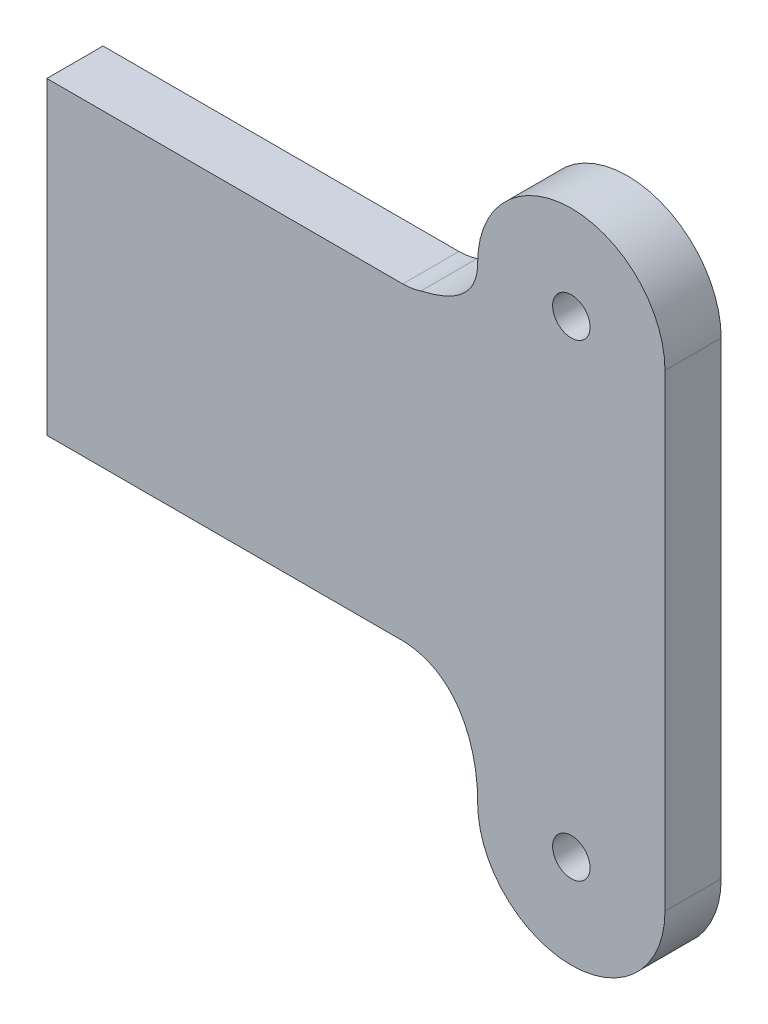
ISO-10303-21;
HEADER;
FILE_DESCRIPTION(('STEP AP214'),'2;1');
FILE_NAME('part.step','',(''),(''),'','','');
FILE_SCHEMA(('AUTOMOTIVE_DESIGN { 1 0 10303 214 1 1 1 1 }'));
ENDSEC;
DATA;
#1=APPLICATION_CONTEXT('core data for automotive mechanical design processes');
#2=APPLICATION_PROTOCOL_DEFINITION('international standard','automotive_design',2000,#1);
#3=PRODUCT_CONTEXT('',#1,'mechanical');
#4=PRODUCT('Part','Part','',(#3));
#5=PRODUCT_RELATED_PRODUCT_CATEGORY('part','',(#4));
#6=PRODUCT_DEFINITION_FORMATION('','',#4);
#7=PRODUCT_DEFINITION_CONTEXT('part definition',#1,'design');
#8=PRODUCT_DEFINITION('design','',#6,#7);
#9=PRODUCT_DEFINITION_SHAPE('','',#8);
#10=(LENGTH_UNIT() NAMED_UNIT(*) SI_UNIT(.MILLI.,.METRE.));
#11=(NAMED_UNIT(*) PLANE_ANGLE_UNIT() SI_UNIT($,.RADIAN.));
#12=(NAMED_UNIT(*) SI_UNIT($,.STERADIAN.) SOLID_ANGLE_UNIT());
#13=UNCERTAINTY_MEASURE_WITH_UNIT(LENGTH_MEASURE(1.E-05),#10,'distance_accuracy_value','');
#14=(GEOMETRIC_REPRESENTATION_CONTEXT(3) GLOBAL_UNCERTAINTY_ASSIGNED_CONTEXT((#13)) GLOBAL_UNIT_ASSIGNED_CONTEXT((#10,
#11,#12)) REPRESENTATION_CONTEXT('',''));
#15=CARTESIAN_POINT('',(0.,0.,0.));
#16=DIRECTION('',(0.,0.,1.));
#17=DIRECTION('',(1.,0.,0.));
#18=AXIS2_PLACEMENT_3D('',#15,#16,#17);
#19=CARTESIAN_POINT('',(9.,9.5,3.));
#20=DIRECTION('',(0.,0.,-1.));
#21=DIRECTION('',(-1.,0.,0.));
#22=AXIS2_PLACEMENT_3D('',#19,#20,#21);
#23=PLANE('',#22);
#24=DIRECTION('',(-1.,0.,0.));
#25=VECTOR('',#24,1.);
#26=CARTESIAN_POINT('',(0.,6.5,3.));
#27=LINE('',#26,#25);
#28=CARTESIAN_POINT('',(8.99999999999998,6.5,3.));
#29=VERTEX_POINT('',#28);
#30=CARTESIAN_POINT('',(-10.,6.5,3.));
#31=VERTEX_POINT('',#30);
#32=EDGE_CURVE('E89',#29,#31,#27,.T.);
#33=ORIENTED_EDGE('',*,*,#32,.T.);
#34=DIRECTION('',(0.,1.,0.));
#35=VECTOR('',#34,1.);
#36=CARTESIAN_POINT('',(-10.,0.,3.));
#37=LINE('',#36,#35);
#38=CARTESIAN_POINT('',(-10.,-10.,3.));
#39=VERTEX_POINT('',#38);
#40=EDGE_CURVE('E202',#39,#31,#37,.T.);
#41=ORIENTED_EDGE('',*,*,#40,.F.);
#42=DIRECTION('',(1.,0.,0.));
#43=VECTOR('',#42,1.);
#44=CARTESIAN_POINT('',(0.,-10.,3.));
#45=LINE('',#44,#43);
#46=CARTESIAN_POINT('',(8.99999999999998,-10.,3.));
#47=VERTEX_POINT('',#46);
#48=EDGE_CURVE('E98',#39,#47,#45,.T.);
#49=ORIENTED_EDGE('',*,*,#48,.T.);
#50=CARTESIAN_POINT('',(9.,-13.,3.));
#51=DIRECTION('',(0.,0.,-1.));
#52=DIRECTION('',(-1.,0.,0.));
#53=AXIS2_PLACEMENT_3D('',#50,#51,#52);
#54=CIRCLE('',#53,3.);
#55=CARTESIAN_POINT('',(9.57348949196098,-10.0553251787998,3.));
#56=VERTEX_POINT('',#55);
#57=EDGE_CURVE('E100',#47,#56,#54,.T.);
#58=ORIENTED_EDGE('',*,*,#57,.T.);
#59=CARTESIAN_POINT('',(13.,-15.5,3.));
#60=CARTESIAN_POINT('',(13.0299558549235,-13.2332861813531,3.));
#61=CARTESIAN_POINT('',(12.1219404571055,-10.098320494566,3.));
#62=CARTESIAN_POINT('',(8.99999999999998,-10.,3.));
#63=B_SPLINE_CURVE_WITH_KNOTS('',3,(#59,#60,#61,#62),.UNSPECIFIED.,.F.,.F.,(4,4),(0.,1.),.UNSPECIFIED.);
#64=CARTESIAN_POINT('',(13.0000000000001,-15.5,3.));
#65=VERTEX_POINT('',#64);
#66=EDGE_CURVE('E125',#65,#56,#63,.T.);
#67=ORIENTED_EDGE('',*,*,#66,.F.);
#68=CARTESIAN_POINT('',(18.,-15.5,3.));
#69=DIRECTION('',(0.,0.,1.));
#70=DIRECTION('',(1.,0.,0.));
#71=AXIS2_PLACEMENT_3D('',#68,#69,#70);
#72=CIRCLE('',#71,4.99999999999991);
#73=CARTESIAN_POINT('',(23.,-15.5,3.));
#74=VERTEX_POINT('',#73);
#75=EDGE_CURVE('E197',#65,#74,#72,.T.);
#76=ORIENTED_EDGE('',*,*,#75,.T.);
#77=DIRECTION('',(0.,-1.,0.));
#78=VECTOR('',#77,1.);
#79=CARTESIAN_POINT('',(23.,0.,3.));
#80=LINE('',#79,#78);
#81=CARTESIAN_POINT('',(23.,9.5,3.));
#82=VERTEX_POINT('',#81);
#83=EDGE_CURVE('E194',#82,#74,#80,.T.);
#84=ORIENTED_EDGE('',*,*,#83,.F.);
#85=CARTESIAN_POINT('',(18.,9.5,3.));
#86=DIRECTION('',(0.,0.,1.));
#87=DIRECTION('',(1.,0.,0.));
#88=AXIS2_PLACEMENT_3D('',#85,#86,#87);
#89=CIRCLE('',#88,5.);
#90=CARTESIAN_POINT('',(13.,9.5,3.));
#91=VERTEX_POINT('',#90);
#92=EDGE_CURVE('E188',#82,#91,#89,.T.);
#93=ORIENTED_EDGE('',*,*,#92,.T.);
#94=CARTESIAN_POINT('',(8.99999999999998,6.5,3.));
#95=CARTESIAN_POINT('',(13.0231606093995,7.00010728506755,3.));
#96=CARTESIAN_POINT('',(13.,9.5,3.));
#97=B_SPLINE_CURVE_WITH_KNOTS('',2,(#94,#95,#96),.UNSPECIFIED.,.F.,.F.,(3,3),(0.,1.),.UNSPECIFIED.);
#98=CARTESIAN_POINT('',(9.97809460156707,6.66392331725932,3.));
#99=VERTEX_POINT('',#98);
#100=EDGE_CURVE('E174',#99,#91,#97,.T.);
#101=ORIENTED_EDGE('',*,*,#100,.F.);
#102=CARTESIAN_POINT('',(9.,9.5,3.));
#103=DIRECTION('',(0.,0.,-1.));
#104=DIRECTION('',(-1.,0.,0.));
#105=AXIS2_PLACEMENT_3D('',#102,#103,#104);
#106=CIRCLE('',#105,3.);
#107=EDGE_CURVE('E59',#99,#29,#106,.T.);
#108=ORIENTED_EDGE('',*,*,#107,.T.);
#109=EDGE_LOOP('',(#33,#41,#49,#58,#67,#76,#84,#93,#101,#108));
#110=FACE_BOUND('',#109,.T.);
#111=CARTESIAN_POINT('',(18.,-15.5,3.));
#112=DIRECTION('',(0.,0.,1.));
#113=DIRECTION('',(1.,0.,0.));
#114=AXIS2_PLACEMENT_3D('',#111,#112,#113);
#115=CIRCLE('',#114,1.);
#116=CARTESIAN_POINT('',(19.,-15.5,3.));
#117=VERTEX_POINT('',#116);
#118=EDGE_CURVE('E135',#117,#117,#115,.T.);
#119=ORIENTED_EDGE('',*,*,#118,.F.);
#120=EDGE_LOOP('',(#119));
#121=FACE_BOUND('',#120,.T.);
#122=CARTESIAN_POINT('',(18.,9.5,3.));
#123=DIRECTION('',(0.,0.,1.));
#124=DIRECTION('',(1.,0.,0.));
#125=AXIS2_PLACEMENT_3D('',#122,#123,#124);
#126=CIRCLE('',#125,1.);
#127=CARTESIAN_POINT('',(19.,9.5,3.));
#128=VERTEX_POINT('',#127);
#129=EDGE_CURVE('E144',#128,#128,#126,.T.);
#130=ORIENTED_EDGE('',*,*,#129,.F.);
#131=EDGE_LOOP('',(#130));
#132=FACE_BOUND('',#131,.T.);
#133=ADVANCED_FACE('F35',(#110,#121,#132),#23,.F.);
#134=CARTESIAN_POINT('',(9.,9.5,0.));
#135=DIRECTION('',(0.,0.,-1.));
#136=DIRECTION('',(-1.,0.,0.));
#137=AXIS2_PLACEMENT_3D('',#134,#135,#136);
#138=PLANE('',#137);
#139=DIRECTION('',(0.,-1.,0.));
#140=VECTOR('',#139,1.);
#141=CARTESIAN_POINT('',(-10.,0.,0.));
#142=LINE('',#141,#140);
#143=CARTESIAN_POINT('',(-10.,6.5,0.));
#144=VERTEX_POINT('',#143);
#145=CARTESIAN_POINT('',(-10.,-10.,0.));
#146=VERTEX_POINT('',#145);
#147=EDGE_CURVE('E97',#144,#146,#142,.T.);
#148=ORIENTED_EDGE('',*,*,#147,.F.);
#149=DIRECTION('',(-1.,0.,0.));
#150=VECTOR('',#149,1.);
#151=CARTESIAN_POINT('',(0.,6.5,0.));
#152=LINE('',#151,#150);
#153=CARTESIAN_POINT('',(8.99999999999998,6.5,0.));
#154=VERTEX_POINT('',#153);
#155=EDGE_CURVE('E80',#154,#144,#152,.T.);
#156=ORIENTED_EDGE('',*,*,#155,.F.);
#157=CARTESIAN_POINT('',(9.,9.5,0.));
#158=DIRECTION('',(0.,0.,-1.));
#159=DIRECTION('',(-1.,0.,0.));
#160=AXIS2_PLACEMENT_3D('',#157,#158,#159);
#161=CIRCLE('',#160,3.);
#162=CARTESIAN_POINT('',(9.97809460156707,6.66392331725932,0.));
#163=VERTEX_POINT('',#162);
#164=EDGE_CURVE('E72',#163,#154,#161,.T.);
#165=ORIENTED_EDGE('',*,*,#164,.F.);
#166=CARTESIAN_POINT('',(8.99999999999998,6.5,0.));
#167=CARTESIAN_POINT('',(13.0231606093995,7.00010728506755,0.));
#168=CARTESIAN_POINT('',(13.,9.5,0.));
#169=B_SPLINE_CURVE_WITH_KNOTS('',2,(#166,#167,#168),.UNSPECIFIED.,.F.,.F.,(3,3),(0.,1.),.UNSPECIFIED.);
#170=CARTESIAN_POINT('',(13.,9.5,0.));
#171=VERTEX_POINT('',#170);
#172=EDGE_CURVE('E50',#171,#163,#169,.F.);
#173=ORIENTED_EDGE('',*,*,#172,.F.);
#174=CARTESIAN_POINT('',(18.,9.5,0.));
#175=DIRECTION('',(0.,0.,-1.));
#176=DIRECTION('',(-1.,0.,0.));
#177=AXIS2_PLACEMENT_3D('',#174,#175,#176);
#178=CIRCLE('',#177,5.);
#179=CARTESIAN_POINT('',(23.,9.5,0.));
#180=VERTEX_POINT('',#179);
#181=EDGE_CURVE('E161',#171,#180,#178,.T.);
#182=ORIENTED_EDGE('',*,*,#181,.T.);
#183=DIRECTION('',(0.,1.,0.));
#184=VECTOR('',#183,1.);
#185=CARTESIAN_POINT('',(23.,9.5,0.));
#186=LINE('',#185,#184);
#187=CARTESIAN_POINT('',(23.,-15.5,0.));
#188=VERTEX_POINT('',#187);
#189=EDGE_CURVE('E11',#188,#180,#186,.T.);
#190=ORIENTED_EDGE('',*,*,#189,.F.);
#191=CARTESIAN_POINT('',(18.,-15.5,0.));
#192=DIRECTION('',(0.,0.,-1.));
#193=DIRECTION('',(-1.,0.,0.));
#194=AXIS2_PLACEMENT_3D('',#191,#192,#193);
#195=CIRCLE('',#194,4.99999999999991);
#196=CARTESIAN_POINT('',(13.0000000000001,-15.5,0.));
#197=VERTEX_POINT('',#196);
#198=EDGE_CURVE('E155',#188,#197,#195,.T.);
#199=ORIENTED_EDGE('',*,*,#198,.T.);
#200=CARTESIAN_POINT('',(13.,-15.5,0.));
#201=CARTESIAN_POINT('',(13.0299558549235,-13.2332861813531,0.));
#202=CARTESIAN_POINT('',(12.1219404571055,-10.098320494566,0.));
#203=CARTESIAN_POINT('',(8.99999999999998,-10.,0.));
#204=B_SPLINE_CURVE_WITH_KNOTS('',3,(#200,#201,#202,#203),.UNSPECIFIED.,.F.,.F.,(4,4),(0.,1.),.UNSPECIFIED.);
#205=CARTESIAN_POINT('',(9.57348949196098,-10.0553251787998,0.));
#206=VERTEX_POINT('',#205);
#207=EDGE_CURVE('E149',#206,#197,#204,.F.);
#208=ORIENTED_EDGE('',*,*,#207,.F.);
#209=CARTESIAN_POINT('',(9.,-13.,0.));
#210=DIRECTION('',(0.,0.,-1.));
#211=DIRECTION('',(-1.,0.,0.));
#212=AXIS2_PLACEMENT_3D('',#209,#210,#211);
#213=CIRCLE('',#212,3.);
#214=CARTESIAN_POINT('',(8.99999999999998,-10.,0.));
#215=VERTEX_POINT('',#214);
#216=EDGE_CURVE('E81',#215,#206,#213,.T.);
#217=ORIENTED_EDGE('',*,*,#216,.F.);
#218=DIRECTION('',(1.,0.,0.));
#219=VECTOR('',#218,1.);
#220=CARTESIAN_POINT('',(0.,-10.,0.));
#221=LINE('',#220,#219);
#222=EDGE_CURVE('E134',#146,#215,#221,.T.);
#223=ORIENTED_EDGE('',*,*,#222,.F.);
#224=EDGE_LOOP('',(#148,#156,#165,#173,#182,#190,#199,#208,#217,#223));
#225=FACE_BOUND('',#224,.T.);
#226=CARTESIAN_POINT('',(18.,-15.5,0.));
#227=DIRECTION('',(0.,0.,1.));
#228=DIRECTION('',(1.,0.,0.));
#229=AXIS2_PLACEMENT_3D('',#226,#227,#228);
#230=CIRCLE('',#229,1.);
#231=CARTESIAN_POINT('',(19.,-15.5,0.));
#232=VERTEX_POINT('',#231);
#233=EDGE_CURVE('E139',#232,#232,#230,.T.);
#234=ORIENTED_EDGE('',*,*,#233,.T.);
#235=EDGE_LOOP('',(#234));
#236=FACE_BOUND('',#235,.T.);
#237=CARTESIAN_POINT('',(18.,9.5,0.));
#238=DIRECTION('',(0.,0.,1.));
#239=DIRECTION('',(1.,0.,0.));
#240=AXIS2_PLACEMENT_3D('',#237,#238,#239);
#241=CIRCLE('',#240,1.);
#242=CARTESIAN_POINT('',(19.,9.5,0.));
#243=VERTEX_POINT('',#242);
#244=EDGE_CURVE('E146',#243,#243,#241,.T.);
#245=ORIENTED_EDGE('',*,*,#244,.T.);
#246=EDGE_LOOP('',(#245));
#247=FACE_BOUND('',#246,.T.);
#248=ADVANCED_FACE('F93',(#225,#236,#247),#138,.T.);
#249=CARTESIAN_POINT('',(9.,-13.,3.));
#250=DIRECTION('',(0.,0.,-1.));
#251=DIRECTION('',(-1.,0.,0.));
#252=AXIS2_PLACEMENT_3D('',#249,#250,#251);
#253=CYLINDRICAL_SURFACE('',#252,3.);
#254=ORIENTED_EDGE('',*,*,#216,.T.);
#255=DIRECTION('',(0.,0.,1.));
#256=VECTOR('',#255,1.);
#257=CARTESIAN_POINT('',(9.57348949196098,-10.0553251787998,-7.));
#258=LINE('',#257,#256);
#259=EDGE_CURVE('E43',#206,#56,#258,.T.);
#260=ORIENTED_EDGE('',*,*,#259,.T.);
#261=ORIENTED_EDGE('',*,*,#57,.F.);
#262=DIRECTION('',(0.,0.,-1.));
#263=VECTOR('',#262,1.);
#264=CARTESIAN_POINT('',(8.99999999999998,-10.,3.));
#265=LINE('',#264,#263);
#266=EDGE_CURVE('E90',#47,#215,#265,.T.);
#267=ORIENTED_EDGE('',*,*,#266,.T.);
#268=EDGE_LOOP('',(#254,#260,#261,#267));
#269=FACE_BOUND('',#268,.T.);
#270=ADVANCED_FACE('F112',(#269),#253,.F.);
#271=CARTESIAN_POINT('',(9.,9.5,3.));
#272=DIRECTION('',(0.,0.,-1.));
#273=DIRECTION('',(-1.,0.,0.));
#274=AXIS2_PLACEMENT_3D('',#271,#272,#273);
#275=CYLINDRICAL_SURFACE('',#274,3.);
#276=ORIENTED_EDGE('',*,*,#107,.F.);
#277=DIRECTION('',(0.,0.,1.));
#278=VECTOR('',#277,1.);
#279=CARTESIAN_POINT('',(9.97809460156707,6.66392331725932,-7.));
#280=LINE('',#279,#278);
#281=EDGE_CURVE('E77',#163,#99,#280,.T.);
#282=ORIENTED_EDGE('',*,*,#281,.F.);
#283=ORIENTED_EDGE('',*,*,#164,.T.);
#284=DIRECTION('',(0.,0.,-1.));
#285=VECTOR('',#284,1.);
#286=CARTESIAN_POINT('',(8.99999999999998,6.5,3.));
#287=LINE('',#286,#285);
#288=EDGE_CURVE('E75',#29,#154,#287,.T.);
#289=ORIENTED_EDGE('',*,*,#288,.F.);
#290=EDGE_LOOP('',(#276,#282,#283,#289));
#291=FACE_BOUND('',#290,.T.);
#292=ADVANCED_FACE('F74',(#291),#275,.F.);
#293=CARTESIAN_POINT('',(0.,-10.,3.));
#294=DIRECTION('',(0.,1.,0.));
#295=DIRECTION('',(0.,0.,1.));
#296=AXIS2_PLACEMENT_3D('',#293,#294,#295);
#297=PLANE('',#296);
#298=ORIENTED_EDGE('',*,*,#222,.T.);
#299=ORIENTED_EDGE('',*,*,#266,.F.);
#300=ORIENTED_EDGE('',*,*,#48,.F.);
#301=DIRECTION('',(0.,0.,1.));
#302=VECTOR('',#301,1.);
#303=CARTESIAN_POINT('',(-10.,-10.,3.));
#304=LINE('',#303,#302);
#305=EDGE_CURVE('E375',#146,#39,#304,.T.);
#306=ORIENTED_EDGE('',*,*,#305,.F.);
#307=EDGE_LOOP('',(#298,#299,#300,#306));
#308=FACE_BOUND('',#307,.T.);
#309=ADVANCED_FACE('F37',(#308),#297,.F.);
#310=CARTESIAN_POINT('',(0.,6.5,3.));
#311=DIRECTION('',(0.,-1.,0.));
#312=DIRECTION('',(1.,0.,0.));
#313=AXIS2_PLACEMENT_3D('',#310,#311,#312);
#314=PLANE('',#313);
#315=ORIENTED_EDGE('',*,*,#155,.T.);
#316=DIRECTION('',(0.,0.,-1.));
#317=VECTOR('',#316,1.);
#318=CARTESIAN_POINT('',(-10.,6.5,3.));
#319=LINE('',#318,#317);
#320=EDGE_CURVE('E373',#31,#144,#319,.T.);
#321=ORIENTED_EDGE('',*,*,#320,.F.);
#322=ORIENTED_EDGE('',*,*,#32,.F.);
#323=ORIENTED_EDGE('',*,*,#288,.T.);
#324=EDGE_LOOP('',(#315,#321,#322,#323));
#325=FACE_BOUND('',#324,.T.);
#326=ADVANCED_FACE('F85',(#325),#314,.F.);
#327=CARTESIAN_POINT('',(18.,-15.5,3.));
#328=DIRECTION('',(0.,0.,-1.));
#329=DIRECTION('',(-1.,0.,0.));
#330=AXIS2_PLACEMENT_3D('',#327,#328,#329);
#331=CYLINDRICAL_SURFACE('',#330,1.);
#332=ORIENTED_EDGE('',*,*,#118,.T.);
#333=EDGE_LOOP('',(#332));
#334=FACE_BOUND('',#333,.T.);
#335=ORIENTED_EDGE('',*,*,#233,.F.);
#336=EDGE_LOOP('',(#335));
#337=FACE_BOUND('',#336,.T.);
#338=ADVANCED_FACE('F241',(#334,#337),#331,.F.);
#339=CARTESIAN_POINT('',(18.,9.5,3.));
#340=DIRECTION('',(0.,0.,-1.));
#341=DIRECTION('',(-1.,0.,0.));
#342=AXIS2_PLACEMENT_3D('',#339,#340,#341);
#343=CYLINDRICAL_SURFACE('',#342,1.);
#344=ORIENTED_EDGE('',*,*,#129,.T.);
#345=EDGE_LOOP('',(#344));
#346=FACE_BOUND('',#345,.T.);
#347=ORIENTED_EDGE('',*,*,#244,.F.);
#348=EDGE_LOOP('',(#347));
#349=FACE_BOUND('',#348,.T.);
#350=ADVANCED_FACE('F235',(#346,#349),#343,.F.);
#351=CARTESIAN_POINT('',(18.,-15.5,-7.));
#352=DIRECTION('',(0.,0.,1.));
#353=DIRECTION('',(1.,0.,0.));
#354=AXIS2_PLACEMENT_3D('',#351,#352,#353);
#355=CYLINDRICAL_SURFACE('',#354,4.99999999999991);
#356=ORIENTED_EDGE('',*,*,#198,.F.);
#357=DIRECTION('',(0.,0.,1.));
#358=VECTOR('',#357,1.);
#359=CARTESIAN_POINT('',(23.,-15.5,-7.));
#360=LINE('',#359,#358);
#361=EDGE_CURVE('E173',#188,#74,#360,.T.);
#362=ORIENTED_EDGE('',*,*,#361,.T.);
#363=ORIENTED_EDGE('',*,*,#75,.F.);
#364=DIRECTION('',(0.,0.,1.));
#365=VECTOR('',#364,1.);
#366=CARTESIAN_POINT('',(13.0000000000001,-15.5,-7.));
#367=LINE('',#366,#365);
#368=EDGE_CURVE('E167',#197,#65,#367,.T.);
#369=ORIENTED_EDGE('',*,*,#368,.F.);
#370=EDGE_LOOP('',(#356,#362,#363,#369));
#371=FACE_BOUND('',#370,.T.);
#372=ADVANCED_FACE('F228',(#371),#355,.T.);
#373=CARTESIAN_POINT('',(18.,9.5,-7.));
#374=DIRECTION('',(0.,0.,1.));
#375=DIRECTION('',(1.,0.,0.));
#376=AXIS2_PLACEMENT_3D('',#373,#374,#375);
#377=CYLINDRICAL_SURFACE('',#376,5.);
#378=ORIENTED_EDGE('',*,*,#181,.F.);
#379=DIRECTION('',(0.,0.,1.));
#380=VECTOR('',#379,1.);
#381=CARTESIAN_POINT('',(13.,9.5,-7.));
#382=LINE('',#381,#380);
#383=EDGE_CURVE('E180',#171,#91,#382,.T.);
#384=ORIENTED_EDGE('',*,*,#383,.T.);
#385=ORIENTED_EDGE('',*,*,#92,.F.);
#386=DIRECTION('',(0.,0.,1.));
#387=VECTOR('',#386,1.);
#388=CARTESIAN_POINT('',(23.,9.5,-7.));
#389=LINE('',#388,#387);
#390=EDGE_CURVE('E177',#180,#82,#389,.T.);
#391=ORIENTED_EDGE('',*,*,#390,.F.);
#392=EDGE_LOOP('',(#378,#384,#385,#391));
#393=FACE_BOUND('',#392,.T.);
#394=ADVANCED_FACE('F225',(#393),#377,.T.);
#395=CARTESIAN_POINT('',(13.,-15.5,-7.));
#396=CARTESIAN_POINT('',(13.0299558549235,-13.2332861813531,-7.));
#397=CARTESIAN_POINT('',(12.1219404571055,-10.098320494566,-7.));
#398=CARTESIAN_POINT('',(8.99999999999998,-10.,-7.));
#399=B_SPLINE_CURVE_WITH_KNOTS('',3,(#395,#396,#397,#398),.UNSPECIFIED.,.F.,.F.,(4,4),(0.,1.),.UNSPECIFIED.);
#400=DIRECTION('',(0.,0.,1.));
#401=VECTOR('',#400,1.);
#402=SURFACE_OF_LINEAR_EXTRUSION('',#399,#401);
#403=ORIENTED_EDGE('',*,*,#259,.F.);
#404=ORIENTED_EDGE('',*,*,#207,.T.);
#405=ORIENTED_EDGE('',*,*,#368,.T.);
#406=ORIENTED_EDGE('',*,*,#66,.T.);
#407=EDGE_LOOP('',(#403,#404,#405,#406));
#408=FACE_BOUND('',#407,.T.);
#409=ADVANCED_FACE('F223',(#408),#402,.F.);
#410=CARTESIAN_POINT('',(8.99999999999998,6.5,-7.));
#411=CARTESIAN_POINT('',(13.0231606093995,7.00010728506755,-7.));
#412=CARTESIAN_POINT('',(13.,9.5,-7.));
#413=B_SPLINE_CURVE_WITH_KNOTS('',2,(#410,#411,#412),.UNSPECIFIED.,.F.,.F.,(3,3),(0.,1.),.UNSPECIFIED.);
#414=DIRECTION('',(0.,0.,1.));
#415=VECTOR('',#414,1.);
#416=SURFACE_OF_LINEAR_EXTRUSION('',#413,#415);
#417=ORIENTED_EDGE('',*,*,#383,.F.);
#418=ORIENTED_EDGE('',*,*,#172,.T.);
#419=ORIENTED_EDGE('',*,*,#281,.T.);
#420=ORIENTED_EDGE('',*,*,#100,.T.);
#421=EDGE_LOOP('',(#417,#418,#419,#420));
#422=FACE_BOUND('',#421,.T.);
#423=ADVANCED_FACE('F218',(#422),#416,.F.);
#424=CARTESIAN_POINT('',(23.,0.,-7.));
#425=DIRECTION('',(-1.,0.,0.));
#426=DIRECTION('',(0.,-1.,0.));
#427=AXIS2_PLACEMENT_3D('',#424,#425,#426);
#428=PLANE('',#427);
#429=ORIENTED_EDGE('',*,*,#361,.F.);
#430=ORIENTED_EDGE('',*,*,#189,.T.);
#431=ORIENTED_EDGE('',*,*,#390,.T.);
#432=ORIENTED_EDGE('',*,*,#83,.T.);
#433=EDGE_LOOP('',(#429,#430,#431,#432));
#434=FACE_BOUND('',#433,.T.);
#435=ADVANCED_FACE('F222',(#434),#428,.F.);
#436=CARTESIAN_POINT('',(-10.,0.,0.));
#437=DIRECTION('',(-1.,0.,0.));
#438=DIRECTION('',(0.,-1.,0.));
#439=AXIS2_PLACEMENT_3D('',#436,#437,#438);
#440=PLANE('',#439);
#441=ORIENTED_EDGE('',*,*,#40,.T.);
#442=ORIENTED_EDGE('',*,*,#320,.T.);
#443=ORIENTED_EDGE('',*,*,#147,.T.);
#444=ORIENTED_EDGE('',*,*,#305,.T.);
#445=EDGE_LOOP('',(#441,#442,#443,#444));
#446=FACE_BOUND('',#445,.T.);
#447=ADVANCED_FACE('F224',(#446),#440,.T.);
#448=CLOSED_SHELL('',(#133,#248,#270,#292,#309,#326,#338,#350,#372,#394,#409,#423,#435,#447));
#449=MANIFOLD_SOLID_BREP('B2',#448);
#450=ADVANCED_BREP_SHAPE_REPRESENTATION('',(#18,#449),#14);
#451=SHAPE_DEFINITION_REPRESENTATION(#9,#450);
ENDSEC;
END-ISO-10303-21;
